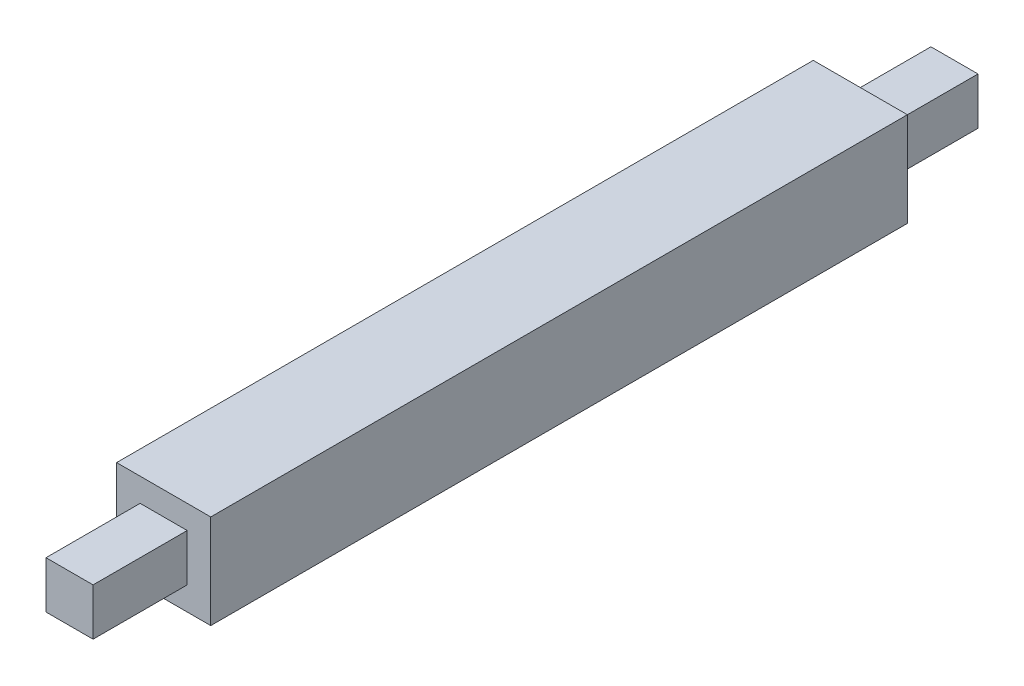
ISO-10303-21;
HEADER;
FILE_DESCRIPTION(('STEP AP214'),'2;1');
FILE_NAME('part.step','',(''),(''),'','','');
FILE_SCHEMA(('AUTOMOTIVE_DESIGN { 1 0 10303 214 1 1 1 1 }'));
ENDSEC;
DATA;
#1=APPLICATION_CONTEXT('core data for automotive mechanical design processes');
#2=APPLICATION_PROTOCOL_DEFINITION('international standard','automotive_design',2000,#1);
#3=PRODUCT_CONTEXT('',#1,'mechanical');
#4=PRODUCT('Part','Part','',(#3));
#5=PRODUCT_RELATED_PRODUCT_CATEGORY('part','',(#4));
#6=PRODUCT_DEFINITION_FORMATION('','',#4);
#7=PRODUCT_DEFINITION_CONTEXT('part definition',#1,'design');
#8=PRODUCT_DEFINITION('design','',#6,#7);
#9=PRODUCT_DEFINITION_SHAPE('','',#8);
#10=(LENGTH_UNIT() NAMED_UNIT(*) SI_UNIT(.MILLI.,.METRE.));
#11=(NAMED_UNIT(*) PLANE_ANGLE_UNIT() SI_UNIT($,.RADIAN.));
#12=(NAMED_UNIT(*) SI_UNIT($,.STERADIAN.) SOLID_ANGLE_UNIT());
#13=UNCERTAINTY_MEASURE_WITH_UNIT(LENGTH_MEASURE(1.E-05),#10,'distance_accuracy_value','');
#14=(GEOMETRIC_REPRESENTATION_CONTEXT(3) GLOBAL_UNCERTAINTY_ASSIGNED_CONTEXT((#13)) GLOBAL_UNIT_ASSIGNED_CONTEXT((#10,
#11,#12)) REPRESENTATION_CONTEXT('',''));
#15=CARTESIAN_POINT('',(0.,0.,0.));
#16=DIRECTION('',(0.,0.,1.));
#17=DIRECTION('',(1.,0.,0.));
#18=AXIS2_PLACEMENT_3D('',#15,#16,#17);
#19=CARTESIAN_POINT('',(0.,0.,37.));
#20=DIRECTION('',(0.,0.,-1.));
#21=DIRECTION('',(-1.,0.,0.));
#22=AXIS2_PLACEMENT_3D('',#19,#20,#21);
#23=PLANE('',#22);
#24=DIRECTION('',(0.,-1.,0.));
#25=VECTOR('',#24,1.);
#26=CARTESIAN_POINT('',(0.,0.,37.));
#27=LINE('',#26,#25);
#28=CARTESIAN_POINT('',(0.,5.,37.));
#29=VERTEX_POINT('',#28);
#30=CARTESIAN_POINT('',(0.,0.,37.));
#31=VERTEX_POINT('',#30);
#32=EDGE_CURVE('E181',#29,#31,#27,.T.);
#33=ORIENTED_EDGE('',*,*,#32,.T.);
#34=DIRECTION('',(1.,0.,0.));
#35=VECTOR('',#34,1.);
#36=CARTESIAN_POINT('',(0.,0.,37.));
#37=LINE('',#36,#35);
#38=CARTESIAN_POINT('',(5.,0.,37.));
#39=VERTEX_POINT('',#38);
#40=EDGE_CURVE('E184',#31,#39,#37,.T.);
#41=ORIENTED_EDGE('',*,*,#40,.T.);
#42=DIRECTION('',(0.,1.,0.));
#43=VECTOR('',#42,1.);
#44=CARTESIAN_POINT('',(5.,0.,37.));
#45=LINE('',#44,#43);
#46=CARTESIAN_POINT('',(5.,5.,37.));
#47=VERTEX_POINT('',#46);
#48=EDGE_CURVE('E187',#39,#47,#45,.T.);
#49=ORIENTED_EDGE('',*,*,#48,.T.);
#50=DIRECTION('',(-1.,0.,0.));
#51=VECTOR('',#50,1.);
#52=CARTESIAN_POINT('',(0.,5.,37.));
#53=LINE('',#52,#51);
#54=EDGE_CURVE('E189',#47,#29,#53,.T.);
#55=ORIENTED_EDGE('',*,*,#54,.T.);
#56=EDGE_LOOP('',(#33,#41,#49,#55));
#57=FACE_BOUND('',#56,.T.);
#58=DIRECTION('',(0.,-1.,0.));
#59=VECTOR('',#58,1.);
#60=CARTESIAN_POINT('',(1.25,1.25,37.));
#61=LINE('',#60,#59);
#62=CARTESIAN_POINT('',(1.25,3.75,37.));
#63=VERTEX_POINT('',#62);
#64=CARTESIAN_POINT('',(1.25,1.25,37.));
#65=VERTEX_POINT('',#64);
#66=EDGE_CURVE('E142',#63,#65,#61,.T.);
#67=ORIENTED_EDGE('',*,*,#66,.F.);
#68=DIRECTION('',(-1.,0.,0.));
#69=VECTOR('',#68,1.);
#70=CARTESIAN_POINT('',(1.25,3.75,37.));
#71=LINE('',#70,#69);
#72=CARTESIAN_POINT('',(3.75,3.75,37.));
#73=VERTEX_POINT('',#72);
#74=EDGE_CURVE('E155',#73,#63,#71,.T.);
#75=ORIENTED_EDGE('',*,*,#74,.F.);
#76=DIRECTION('',(0.,1.,0.));
#77=VECTOR('',#76,1.);
#78=CARTESIAN_POINT('',(3.75,1.25,37.));
#79=LINE('',#78,#77);
#80=CARTESIAN_POINT('',(3.75,1.25,37.));
#81=VERTEX_POINT('',#80);
#82=EDGE_CURVE('E164',#81,#73,#79,.T.);
#83=ORIENTED_EDGE('',*,*,#82,.F.);
#84=DIRECTION('',(1.,0.,0.));
#85=VECTOR('',#84,1.);
#86=CARTESIAN_POINT('',(1.25,1.25,37.));
#87=LINE('',#86,#85);
#88=EDGE_CURVE('E145',#65,#81,#87,.T.);
#89=ORIENTED_EDGE('',*,*,#88,.F.);
#90=EDGE_LOOP('',(#67,#75,#83,#89));
#91=FACE_BOUND('',#90,.T.);
#92=ADVANCED_FACE('F33',(#57,#91),#23,.F.);
#93=CARTESIAN_POINT('',(0.,0.,37.));
#94=DIRECTION('',(1.,0.,0.));
#95=DIRECTION('',(0.,0.,-1.));
#96=AXIS2_PLACEMENT_3D('',#93,#94,#95);
#97=PLANE('',#96);
#98=DIRECTION('',(0.,-1.,0.));
#99=VECTOR('',#98,1.);
#100=CARTESIAN_POINT('',(0.,0.,0.));
#101=LINE('',#100,#99);
#102=CARTESIAN_POINT('',(0.,5.,0.));
#103=VERTEX_POINT('',#102);
#104=CARTESIAN_POINT('',(0.,0.,0.));
#105=VERTEX_POINT('',#104);
#106=EDGE_CURVE('E180',#103,#105,#101,.T.);
#107=ORIENTED_EDGE('',*,*,#106,.T.);
#108=DIRECTION('',(0.,0.,-1.));
#109=VECTOR('',#108,1.);
#110=CARTESIAN_POINT('',(0.,0.,37.));
#111=LINE('',#110,#109);
#112=EDGE_CURVE('E11',#31,#105,#111,.T.);
#113=ORIENTED_EDGE('',*,*,#112,.F.);
#114=ORIENTED_EDGE('',*,*,#32,.F.);
#115=DIRECTION('',(0.,0.,-1.));
#116=VECTOR('',#115,1.);
#117=CARTESIAN_POINT('',(0.,5.,37.));
#118=LINE('',#117,#116);
#119=EDGE_CURVE('E191',#29,#103,#118,.T.);
#120=ORIENTED_EDGE('',*,*,#119,.T.);
#121=EDGE_LOOP('',(#107,#113,#114,#120));
#122=FACE_BOUND('',#121,.T.);
#123=ADVANCED_FACE('F35',(#122),#97,.F.);
#124=CARTESIAN_POINT('',(0.,0.,37.));
#125=DIRECTION('',(0.,1.,0.));
#126=DIRECTION('',(0.,0.,1.));
#127=AXIS2_PLACEMENT_3D('',#124,#125,#126);
#128=PLANE('',#127);
#129=DIRECTION('',(1.,0.,0.));
#130=VECTOR('',#129,1.);
#131=CARTESIAN_POINT('',(0.,0.,0.));
#132=LINE('',#131,#130);
#133=CARTESIAN_POINT('',(5.,0.,0.));
#134=VERTEX_POINT('',#133);
#135=EDGE_CURVE('E194',#105,#134,#132,.T.);
#136=ORIENTED_EDGE('',*,*,#135,.T.);
#137=DIRECTION('',(0.,0.,-1.));
#138=VECTOR('',#137,1.);
#139=CARTESIAN_POINT('',(5.,0.,37.));
#140=LINE('',#139,#138);
#141=EDGE_CURVE('E41',#39,#134,#140,.T.);
#142=ORIENTED_EDGE('',*,*,#141,.F.);
#143=ORIENTED_EDGE('',*,*,#40,.F.);
#144=ORIENTED_EDGE('',*,*,#112,.T.);
#145=EDGE_LOOP('',(#136,#142,#143,#144));
#146=FACE_BOUND('',#145,.T.);
#147=ADVANCED_FACE('F224',(#146),#128,.F.);
#148=CARTESIAN_POINT('',(5.,0.,37.));
#149=DIRECTION('',(-1.,0.,0.));
#150=DIRECTION('',(0.,0.,1.));
#151=AXIS2_PLACEMENT_3D('',#148,#149,#150);
#152=PLANE('',#151);
#153=DIRECTION('',(0.,1.,0.));
#154=VECTOR('',#153,1.);
#155=CARTESIAN_POINT('',(5.,0.,0.));
#156=LINE('',#155,#154);
#157=CARTESIAN_POINT('',(5.,5.,0.));
#158=VERTEX_POINT('',#157);
#159=EDGE_CURVE('E196',#134,#158,#156,.T.);
#160=ORIENTED_EDGE('',*,*,#159,.T.);
#161=DIRECTION('',(0.,0.,-1.));
#162=VECTOR('',#161,1.);
#163=CARTESIAN_POINT('',(5.,5.,37.));
#164=LINE('',#163,#162);
#165=EDGE_CURVE('E201',#47,#158,#164,.T.);
#166=ORIENTED_EDGE('',*,*,#165,.F.);
#167=ORIENTED_EDGE('',*,*,#48,.F.);
#168=ORIENTED_EDGE('',*,*,#141,.T.);
#169=EDGE_LOOP('',(#160,#166,#167,#168));
#170=FACE_BOUND('',#169,.T.);
#171=ADVANCED_FACE('F208',(#170),#152,.F.);
#172=CARTESIAN_POINT('',(0.,5.,37.));
#173=DIRECTION('',(0.,-1.,0.));
#174=DIRECTION('',(0.,0.,-1.));
#175=AXIS2_PLACEMENT_3D('',#172,#173,#174);
#176=PLANE('',#175);
#177=DIRECTION('',(-1.,0.,0.));
#178=VECTOR('',#177,1.);
#179=CARTESIAN_POINT('',(0.,5.,0.));
#180=LINE('',#179,#178);
#181=EDGE_CURVE('E185',#158,#103,#180,.T.);
#182=ORIENTED_EDGE('',*,*,#181,.T.);
#183=ORIENTED_EDGE('',*,*,#119,.F.);
#184=ORIENTED_EDGE('',*,*,#54,.F.);
#185=ORIENTED_EDGE('',*,*,#165,.T.);
#186=EDGE_LOOP('',(#182,#183,#184,#185));
#187=FACE_BOUND('',#186,.T.);
#188=ADVANCED_FACE('F217',(#187),#176,.F.);
#189=CARTESIAN_POINT('',(0.,0.,0.));
#190=DIRECTION('',(0.,0.,-1.));
#191=DIRECTION('',(-1.,0.,0.));
#192=AXIS2_PLACEMENT_3D('',#189,#190,#191);
#193=PLANE('',#192);
#194=DIRECTION('',(0.,-1.,0.));
#195=VECTOR('',#194,1.);
#196=CARTESIAN_POINT('',(3.75,1.25,0.));
#197=LINE('',#196,#195);
#198=CARTESIAN_POINT('',(3.75,3.75,0.));
#199=VERTEX_POINT('',#198);
#200=CARTESIAN_POINT('',(3.75,1.25,0.));
#201=VERTEX_POINT('',#200);
#202=EDGE_CURVE('E48',#199,#201,#197,.T.);
#203=ORIENTED_EDGE('',*,*,#202,.F.);
#204=DIRECTION('',(1.,0.,0.));
#205=VECTOR('',#204,1.);
#206=CARTESIAN_POINT('',(3.75,3.75,0.));
#207=LINE('',#206,#205);
#208=CARTESIAN_POINT('',(1.25,3.75,0.));
#209=VERTEX_POINT('',#208);
#210=EDGE_CURVE('E52',#209,#199,#207,.T.);
#211=ORIENTED_EDGE('',*,*,#210,.F.);
#212=DIRECTION('',(0.,1.,0.));
#213=VECTOR('',#212,1.);
#214=CARTESIAN_POINT('',(1.25,1.25,0.));
#215=LINE('',#214,#213);
#216=CARTESIAN_POINT('',(1.25,1.25,0.));
#217=VERTEX_POINT('',#216);
#218=EDGE_CURVE('E352',#217,#209,#215,.T.);
#219=ORIENTED_EDGE('',*,*,#218,.F.);
#220=DIRECTION('',(-1.,0.,0.));
#221=VECTOR('',#220,1.);
#222=CARTESIAN_POINT('',(3.75,1.25,0.));
#223=LINE('',#222,#221);
#224=EDGE_CURVE('E358',#201,#217,#223,.T.);
#225=ORIENTED_EDGE('',*,*,#224,.F.);
#226=EDGE_LOOP('',(#203,#211,#219,#225));
#227=FACE_BOUND('',#226,.T.);
#228=ORIENTED_EDGE('',*,*,#106,.F.);
#229=ORIENTED_EDGE('',*,*,#181,.F.);
#230=ORIENTED_EDGE('',*,*,#159,.F.);
#231=ORIENTED_EDGE('',*,*,#135,.F.);
#232=EDGE_LOOP('',(#228,#229,#230,#231));
#233=FACE_BOUND('',#232,.T.);
#234=ADVANCED_FACE('F214',(#227,#233),#193,.T.);
#235=CARTESIAN_POINT('',(1.25,1.25,42.));
#236=DIRECTION('',(1.,0.,0.));
#237=DIRECTION('',(0.,0.,-1.));
#238=AXIS2_PLACEMENT_3D('',#235,#236,#237);
#239=PLANE('',#238);
#240=ORIENTED_EDGE('',*,*,#66,.T.);
#241=DIRECTION('',(0.,0.,-1.));
#242=VECTOR('',#241,1.);
#243=CARTESIAN_POINT('',(1.25,1.25,42.));
#244=LINE('',#243,#242);
#245=CARTESIAN_POINT('',(1.25,1.25,42.));
#246=VERTEX_POINT('',#245);
#247=EDGE_CURVE('E177',#246,#65,#244,.T.);
#248=ORIENTED_EDGE('',*,*,#247,.F.);
#249=DIRECTION('',(0.,-1.,0.));
#250=VECTOR('',#249,1.);
#251=CARTESIAN_POINT('',(1.25,1.25,42.));
#252=LINE('',#251,#250);
#253=CARTESIAN_POINT('',(1.25,3.75,42.));
#254=VERTEX_POINT('',#253);
#255=EDGE_CURVE('E151',#254,#246,#252,.T.);
#256=ORIENTED_EDGE('',*,*,#255,.F.);
#257=DIRECTION('',(0.,0.,-1.));
#258=VECTOR('',#257,1.);
#259=CARTESIAN_POINT('',(1.25,3.75,42.));
#260=LINE('',#259,#258);
#261=EDGE_CURVE('E160',#254,#63,#260,.T.);
#262=ORIENTED_EDGE('',*,*,#261,.T.);
#263=EDGE_LOOP('',(#240,#248,#256,#262));
#264=FACE_BOUND('',#263,.T.);
#265=ADVANCED_FACE('F239',(#264),#239,.F.);
#266=CARTESIAN_POINT('',(1.25,1.25,42.));
#267=DIRECTION('',(0.,1.,0.));
#268=DIRECTION('',(0.,0.,1.));
#269=AXIS2_PLACEMENT_3D('',#266,#267,#268);
#270=PLANE('',#269);
#271=ORIENTED_EDGE('',*,*,#88,.T.);
#272=DIRECTION('',(0.,0.,-1.));
#273=VECTOR('',#272,1.);
#274=CARTESIAN_POINT('',(3.75,1.25,42.));
#275=LINE('',#274,#273);
#276=CARTESIAN_POINT('',(3.75,1.25,42.));
#277=VERTEX_POINT('',#276);
#278=EDGE_CURVE('E174',#277,#81,#275,.T.);
#279=ORIENTED_EDGE('',*,*,#278,.F.);
#280=DIRECTION('',(1.,0.,0.));
#281=VECTOR('',#280,1.);
#282=CARTESIAN_POINT('',(1.25,1.25,42.));
#283=LINE('',#282,#281);
#284=EDGE_CURVE('E154',#246,#277,#283,.T.);
#285=ORIENTED_EDGE('',*,*,#284,.F.);
#286=ORIENTED_EDGE('',*,*,#247,.T.);
#287=EDGE_LOOP('',(#271,#279,#285,#286));
#288=FACE_BOUND('',#287,.T.);
#289=ADVANCED_FACE('F265',(#288),#270,.F.);
#290=CARTESIAN_POINT('',(3.75,1.25,42.));
#291=DIRECTION('',(-1.,0.,0.));
#292=DIRECTION('',(0.,0.,1.));
#293=AXIS2_PLACEMENT_3D('',#290,#291,#292);
#294=PLANE('',#293);
#295=ORIENTED_EDGE('',*,*,#82,.T.);
#296=DIRECTION('',(0.,0.,-1.));
#297=VECTOR('',#296,1.);
#298=CARTESIAN_POINT('',(3.75,3.75,42.));
#299=LINE('',#298,#297);
#300=CARTESIAN_POINT('',(3.75,3.75,42.));
#301=VERTEX_POINT('',#300);
#302=EDGE_CURVE('E171',#301,#73,#299,.T.);
#303=ORIENTED_EDGE('',*,*,#302,.F.);
#304=DIRECTION('',(0.,1.,0.));
#305=VECTOR('',#304,1.);
#306=CARTESIAN_POINT('',(3.75,1.25,42.));
#307=LINE('',#306,#305);
#308=EDGE_CURVE('E157',#277,#301,#307,.T.);
#309=ORIENTED_EDGE('',*,*,#308,.F.);
#310=ORIENTED_EDGE('',*,*,#278,.T.);
#311=EDGE_LOOP('',(#295,#303,#309,#310));
#312=FACE_BOUND('',#311,.T.);
#313=ADVANCED_FACE('F271',(#312),#294,.F.);
#314=CARTESIAN_POINT('',(1.25,3.75,42.));
#315=DIRECTION('',(0.,-1.,0.));
#316=DIRECTION('',(0.,0.,-1.));
#317=AXIS2_PLACEMENT_3D('',#314,#315,#316);
#318=PLANE('',#317);
#319=ORIENTED_EDGE('',*,*,#74,.T.);
#320=ORIENTED_EDGE('',*,*,#261,.F.);
#321=DIRECTION('',(-1.,0.,0.));
#322=VECTOR('',#321,1.);
#323=CARTESIAN_POINT('',(1.25,3.75,42.));
#324=LINE('',#323,#322);
#325=EDGE_CURVE('E159',#301,#254,#324,.T.);
#326=ORIENTED_EDGE('',*,*,#325,.F.);
#327=ORIENTED_EDGE('',*,*,#302,.T.);
#328=EDGE_LOOP('',(#319,#320,#326,#327));
#329=FACE_BOUND('',#328,.T.);
#330=ADVANCED_FACE('F278',(#329),#318,.F.);
#331=CARTESIAN_POINT('',(0.,0.,42.));
#332=DIRECTION('',(0.,0.,-1.));
#333=DIRECTION('',(-1.,0.,0.));
#334=AXIS2_PLACEMENT_3D('',#331,#332,#333);
#335=PLANE('',#334);
#336=ORIENTED_EDGE('',*,*,#255,.T.);
#337=ORIENTED_EDGE('',*,*,#284,.T.);
#338=ORIENTED_EDGE('',*,*,#308,.T.);
#339=ORIENTED_EDGE('',*,*,#325,.T.);
#340=EDGE_LOOP('',(#336,#337,#338,#339));
#341=FACE_BOUND('',#340,.T.);
#342=ADVANCED_FACE('F286',(#341),#335,.F.);
#343=CARTESIAN_POINT('',(3.75,1.25,-5.));
#344=DIRECTION('',(-1.,0.,0.));
#345=DIRECTION('',(0.,0.,1.));
#346=AXIS2_PLACEMENT_3D('',#343,#344,#345);
#347=PLANE('',#346);
#348=ORIENTED_EDGE('',*,*,#202,.T.);
#349=DIRECTION('',(0.,0.,1.));
#350=VECTOR('',#349,1.);
#351=CARTESIAN_POINT('',(3.75,1.25,-5.));
#352=LINE('',#351,#350);
#353=CARTESIAN_POINT('',(3.75,1.25,-5.));
#354=VERTEX_POINT('',#353);
#355=EDGE_CURVE('E125',#354,#201,#352,.T.);
#356=ORIENTED_EDGE('',*,*,#355,.F.);
#357=DIRECTION('',(0.,-1.,0.));
#358=VECTOR('',#357,1.);
#359=CARTESIAN_POINT('',(3.75,1.25,-5.));
#360=LINE('',#359,#358);
#361=CARTESIAN_POINT('',(3.75,3.75,-5.));
#362=VERTEX_POINT('',#361);
#363=EDGE_CURVE('E131',#362,#354,#360,.T.);
#364=ORIENTED_EDGE('',*,*,#363,.F.);
#365=DIRECTION('',(0.,0.,1.));
#366=VECTOR('',#365,1.);
#367=CARTESIAN_POINT('',(3.75,3.75,-5.));
#368=LINE('',#367,#366);
#369=EDGE_CURVE('E350',#362,#199,#368,.T.);
#370=ORIENTED_EDGE('',*,*,#369,.T.);
#371=EDGE_LOOP('',(#348,#356,#364,#370));
#372=FACE_BOUND('',#371,.T.);
#373=ADVANCED_FACE('F141',(#372),#347,.F.);
#374=CARTESIAN_POINT('',(3.75,1.25,-5.));
#375=DIRECTION('',(0.,1.,0.));
#376=DIRECTION('',(0.,0.,1.));
#377=AXIS2_PLACEMENT_3D('',#374,#375,#376);
#378=PLANE('',#377);
#379=ORIENTED_EDGE('',*,*,#224,.T.);
#380=DIRECTION('',(0.,0.,1.));
#381=VECTOR('',#380,1.);
#382=CARTESIAN_POINT('',(1.25,1.25,-5.));
#383=LINE('',#382,#381);
#384=CARTESIAN_POINT('',(1.25,1.25,-5.));
#385=VERTEX_POINT('',#384);
#386=EDGE_CURVE('E127',#385,#217,#383,.T.);
#387=ORIENTED_EDGE('',*,*,#386,.F.);
#388=DIRECTION('',(-1.,0.,0.));
#389=VECTOR('',#388,1.);
#390=CARTESIAN_POINT('',(3.75,1.25,-5.));
#391=LINE('',#390,#389);
#392=EDGE_CURVE('E120',#354,#385,#391,.T.);
#393=ORIENTED_EDGE('',*,*,#392,.F.);
#394=ORIENTED_EDGE('',*,*,#355,.T.);
#395=EDGE_LOOP('',(#379,#387,#393,#394));
#396=FACE_BOUND('',#395,.T.);
#397=ADVANCED_FACE('F123',(#396),#378,.F.);
#398=CARTESIAN_POINT('',(1.25,1.25,-5.));
#399=DIRECTION('',(1.,0.,0.));
#400=DIRECTION('',(0.,0.,-1.));
#401=AXIS2_PLACEMENT_3D('',#398,#399,#400);
#402=PLANE('',#401);
#403=ORIENTED_EDGE('',*,*,#218,.T.);
#404=DIRECTION('',(0.,0.,1.));
#405=VECTOR('',#404,1.);
#406=CARTESIAN_POINT('',(1.25,3.75,-5.));
#407=LINE('',#406,#405);
#408=CARTESIAN_POINT('',(1.25,3.75,-5.));
#409=VERTEX_POINT('',#408);
#410=EDGE_CURVE('E147',#409,#209,#407,.T.);
#411=ORIENTED_EDGE('',*,*,#410,.F.);
#412=DIRECTION('',(0.,1.,0.));
#413=VECTOR('',#412,1.);
#414=CARTESIAN_POINT('',(1.25,1.25,-5.));
#415=LINE('',#414,#413);
#416=EDGE_CURVE('E130',#385,#409,#415,.T.);
#417=ORIENTED_EDGE('',*,*,#416,.F.);
#418=ORIENTED_EDGE('',*,*,#386,.T.);
#419=EDGE_LOOP('',(#403,#411,#417,#418));
#420=FACE_BOUND('',#419,.T.);
#421=ADVANCED_FACE('F305',(#420),#402,.F.);
#422=CARTESIAN_POINT('',(3.75,3.75,-5.));
#423=DIRECTION('',(0.,-1.,0.));
#424=DIRECTION('',(0.,0.,-1.));
#425=AXIS2_PLACEMENT_3D('',#422,#423,#424);
#426=PLANE('',#425);
#427=ORIENTED_EDGE('',*,*,#210,.T.);
#428=ORIENTED_EDGE('',*,*,#369,.F.);
#429=DIRECTION('',(1.,0.,0.));
#430=VECTOR('',#429,1.);
#431=CARTESIAN_POINT('',(3.75,3.75,-5.));
#432=LINE('',#431,#430);
#433=EDGE_CURVE('E136',#409,#362,#432,.T.);
#434=ORIENTED_EDGE('',*,*,#433,.F.);
#435=ORIENTED_EDGE('',*,*,#410,.T.);
#436=EDGE_LOOP('',(#427,#428,#434,#435));
#437=FACE_BOUND('',#436,.T.);
#438=ADVANCED_FACE('F312',(#437),#426,.F.);
#439=CARTESIAN_POINT('',(0.,0.,-5.));
#440=DIRECTION('',(0.,0.,1.));
#441=DIRECTION('',(1.,0.,0.));
#442=AXIS2_PLACEMENT_3D('',#439,#440,#441);
#443=PLANE('',#442);
#444=ORIENTED_EDGE('',*,*,#363,.T.);
#445=ORIENTED_EDGE('',*,*,#392,.T.);
#446=ORIENTED_EDGE('',*,*,#416,.T.);
#447=ORIENTED_EDGE('',*,*,#433,.T.);
#448=EDGE_LOOP('',(#444,#445,#446,#447));
#449=FACE_BOUND('',#448,.T.);
#450=ADVANCED_FACE('F134',(#449),#443,.F.);
#451=CLOSED_SHELL('',(#92,#123,#147,#171,#188,#234,#265,#289,#313,#330,#342,#373,#397,#421,#438,#450));
#452=MANIFOLD_SOLID_BREP('B2',#451);
#453=ADVANCED_BREP_SHAPE_REPRESENTATION('',(#18,#452),#14);
#454=SHAPE_DEFINITION_REPRESENTATION(#9,#453);
ENDSEC;
END-ISO-10303-21;
